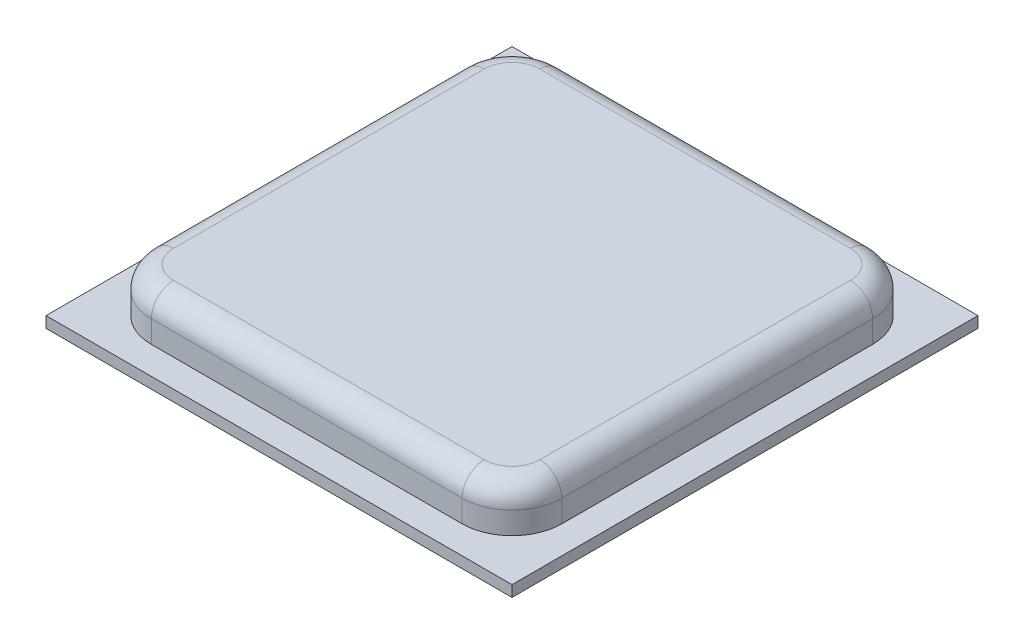
ISO-10303-21;
HEADER;
FILE_DESCRIPTION(('STEP AP214'),'2;1');
FILE_NAME('part.step','',(''),(''),'','','');
FILE_SCHEMA(('AUTOMOTIVE_DESIGN { 1 0 10303 214 1 1 1 1 }'));
ENDSEC;
DATA;
#1=APPLICATION_CONTEXT('core data for automotive mechanical design processes');
#2=APPLICATION_PROTOCOL_DEFINITION('international standard','automotive_design',2000,#1);
#3=PRODUCT_CONTEXT('',#1,'mechanical');
#4=PRODUCT('Part','Part','',(#3));
#5=PRODUCT_RELATED_PRODUCT_CATEGORY('part','',(#4));
#6=PRODUCT_DEFINITION_FORMATION('','',#4);
#7=PRODUCT_DEFINITION_CONTEXT('part definition',#1,'design');
#8=PRODUCT_DEFINITION('design','',#6,#7);
#9=PRODUCT_DEFINITION_SHAPE('','',#8);
#10=(LENGTH_UNIT() NAMED_UNIT(*) SI_UNIT(.MILLI.,.METRE.));
#11=(NAMED_UNIT(*) PLANE_ANGLE_UNIT() SI_UNIT($,.RADIAN.));
#12=(NAMED_UNIT(*) SI_UNIT($,.STERADIAN.) SOLID_ANGLE_UNIT());
#13=UNCERTAINTY_MEASURE_WITH_UNIT(LENGTH_MEASURE(1.E-05),#10,'distance_accuracy_value','');
#14=(GEOMETRIC_REPRESENTATION_CONTEXT(3) GLOBAL_UNCERTAINTY_ASSIGNED_CONTEXT((#13)) GLOBAL_UNIT_ASSIGNED_CONTEXT((#10,
#11,#12)) REPRESENTATION_CONTEXT('',''));
#15=CARTESIAN_POINT('',(0.,0.,0.));
#16=DIRECTION('',(0.,0.,1.));
#17=DIRECTION('',(1.,0.,0.));
#18=AXIS2_PLACEMENT_3D('',#15,#16,#17);
#19=CARTESIAN_POINT('',(0.,0.999999999999997,0.));
#20=DIRECTION('',(0.,1.,0.));
#21=DIRECTION('',(0.,0.,1.));
#22=AXIS2_PLACEMENT_3D('',#19,#20,#21);
#23=PLANE('',#22);
#24=DIRECTION('',(0.,0.,1.));
#25=VECTOR('',#24,1.);
#26=CARTESIAN_POINT('',(-21.,0.999999999999997,21.));
#27=LINE('',#26,#25);
#28=CARTESIAN_POINT('',(-21.,0.999999999999997,-21.));
#29=VERTEX_POINT('',#28);
#30=CARTESIAN_POINT('',(-21.,0.999999999999997,21.));
#31=VERTEX_POINT('',#30);
#32=EDGE_CURVE('E186',#29,#31,#27,.T.);
#33=ORIENTED_EDGE('',*,*,#32,.T.);
#34=DIRECTION('',(1.,0.,0.));
#35=VECTOR('',#34,1.);
#36=CARTESIAN_POINT('',(21.,0.999999999999997,21.));
#37=LINE('',#36,#35);
#38=CARTESIAN_POINT('',(21.,0.999999999999997,21.));
#39=VERTEX_POINT('',#38);
#40=EDGE_CURVE('E189',#31,#39,#37,.T.);
#41=ORIENTED_EDGE('',*,*,#40,.T.);
#42=DIRECTION('',(0.,0.,-1.));
#43=VECTOR('',#42,1.);
#44=CARTESIAN_POINT('',(21.,0.999999999999997,21.));
#45=LINE('',#44,#43);
#46=CARTESIAN_POINT('',(21.,0.999999999999997,-21.));
#47=VERTEX_POINT('',#46);
#48=EDGE_CURVE('E192',#39,#47,#45,.T.);
#49=ORIENTED_EDGE('',*,*,#48,.T.);
#50=DIRECTION('',(-1.,0.,0.));
#51=VECTOR('',#50,1.);
#52=CARTESIAN_POINT('',(21.,0.999999999999997,-21.));
#53=LINE('',#52,#51);
#54=EDGE_CURVE('E194',#47,#29,#53,.T.);
#55=ORIENTED_EDGE('',*,*,#54,.T.);
#56=EDGE_LOOP('',(#33,#41,#49,#55));
#57=FACE_BOUND('',#56,.T.);
#58=DIRECTION('',(0.,0.,1.));
#59=VECTOR('',#58,1.);
#60=CARTESIAN_POINT('',(-18.5,0.999999999999997,14.));
#61=LINE('',#60,#59);
#62=CARTESIAN_POINT('',(-18.5,0.999999999999997,-14.));
#63=VERTEX_POINT('',#62);
#64=CARTESIAN_POINT('',(-18.5,0.999999999999997,14.));
#65=VERTEX_POINT('',#64);
#66=EDGE_CURVE('E310',#63,#65,#61,.T.);
#67=ORIENTED_EDGE('',*,*,#66,.F.);
#68=CARTESIAN_POINT('',(-14.,0.999999999999997,-14.));
#69=DIRECTION('',(0.,1.,0.));
#70=DIRECTION('',(0.,0.,1.));
#71=AXIS2_PLACEMENT_3D('',#68,#69,#70);
#72=CIRCLE('',#71,4.5);
#73=CARTESIAN_POINT('',(-14.,0.999999999999997,-18.5));
#74=VERTEX_POINT('',#73);
#75=EDGE_CURVE('E307',#74,#63,#72,.T.);
#76=ORIENTED_EDGE('',*,*,#75,.F.);
#77=DIRECTION('',(-1.,0.,0.));
#78=VECTOR('',#77,1.);
#79=CARTESIAN_POINT('',(-14.,0.999999999999997,-18.5));
#80=LINE('',#79,#78);
#81=CARTESIAN_POINT('',(14.,0.999999999999997,-18.5));
#82=VERTEX_POINT('',#81);
#83=EDGE_CURVE('E182',#82,#74,#80,.T.);
#84=ORIENTED_EDGE('',*,*,#83,.F.);
#85=CARTESIAN_POINT('',(14.,0.999999999999997,-14.));
#86=DIRECTION('',(0.,1.,0.));
#87=DIRECTION('',(0.,0.,1.));
#88=AXIS2_PLACEMENT_3D('',#85,#86,#87);
#89=CIRCLE('',#88,4.5);
#90=CARTESIAN_POINT('',(18.5,0.999999999999997,-14.));
#91=VERTEX_POINT('',#90);
#92=EDGE_CURVE('E171',#91,#82,#89,.T.);
#93=ORIENTED_EDGE('',*,*,#92,.F.);
#94=DIRECTION('',(0.,0.,-1.));
#95=VECTOR('',#94,1.);
#96=CARTESIAN_POINT('',(18.5,0.999999999999997,14.));
#97=LINE('',#96,#95);
#98=CARTESIAN_POINT('',(18.5,0.999999999999997,14.));
#99=VERTEX_POINT('',#98);
#100=EDGE_CURVE('E154',#99,#91,#97,.T.);
#101=ORIENTED_EDGE('',*,*,#100,.F.);
#102=CARTESIAN_POINT('',(14.,0.999999999999997,14.));
#103=DIRECTION('',(0.,1.,0.));
#104=DIRECTION('',(0.,0.,-1.));
#105=AXIS2_PLACEMENT_3D('',#102,#103,#104);
#106=CIRCLE('',#105,4.5);
#107=CARTESIAN_POINT('',(14.,0.999999999999997,18.5));
#108=VERTEX_POINT('',#107);
#109=EDGE_CURVE('E167',#108,#99,#106,.T.);
#110=ORIENTED_EDGE('',*,*,#109,.F.);
#111=DIRECTION('',(1.,0.,0.));
#112=VECTOR('',#111,1.);
#113=CARTESIAN_POINT('',(-14.,0.999999999999997,18.5));
#114=LINE('',#113,#112);
#115=CARTESIAN_POINT('',(-14.,0.999999999999997,18.5));
#116=VERTEX_POINT('',#115);
#117=EDGE_CURVE('E175',#116,#108,#114,.T.);
#118=ORIENTED_EDGE('',*,*,#117,.F.);
#119=CARTESIAN_POINT('',(-14.,0.999999999999997,14.));
#120=DIRECTION('',(0.,1.,0.));
#121=DIRECTION('',(0.,0.,1.));
#122=AXIS2_PLACEMENT_3D('',#119,#120,#121);
#123=CIRCLE('',#122,4.5);
#124=EDGE_CURVE('E177',#65,#116,#123,.T.);
#125=ORIENTED_EDGE('',*,*,#124,.F.);
#126=EDGE_LOOP('',(#67,#76,#84,#93,#101,#110,#118,#125));
#127=FACE_BOUND('',#126,.T.);
#128=ADVANCED_FACE('F37',(#57,#127),#23,.T.);
#129=CARTESIAN_POINT('',(0.,0.,0.));
#130=DIRECTION('',(0.,1.,0.));
#131=DIRECTION('',(0.,0.,1.));
#132=AXIS2_PLACEMENT_3D('',#129,#130,#131);
#133=PLANE('',#132);
#134=DIRECTION('',(0.,0.,1.));
#135=VECTOR('',#134,1.);
#136=CARTESIAN_POINT('',(-21.,0.,21.));
#137=LINE('',#136,#135);
#138=CARTESIAN_POINT('',(-21.,0.,-21.));
#139=VERTEX_POINT('',#138);
#140=CARTESIAN_POINT('',(-21.,0.,21.));
#141=VERTEX_POINT('',#140);
#142=EDGE_CURVE('E185',#139,#141,#137,.T.);
#143=ORIENTED_EDGE('',*,*,#142,.F.);
#144=DIRECTION('',(-1.,0.,0.));
#145=VECTOR('',#144,1.);
#146=CARTESIAN_POINT('',(21.,0.,-21.));
#147=LINE('',#146,#145);
#148=CARTESIAN_POINT('',(21.,0.,-21.));
#149=VERTEX_POINT('',#148);
#150=EDGE_CURVE('E190',#149,#139,#147,.T.);
#151=ORIENTED_EDGE('',*,*,#150,.F.);
#152=DIRECTION('',(0.,0.,-1.));
#153=VECTOR('',#152,1.);
#154=CARTESIAN_POINT('',(21.,0.,21.));
#155=LINE('',#154,#153);
#156=CARTESIAN_POINT('',(21.,0.,21.));
#157=VERTEX_POINT('',#156);
#158=EDGE_CURVE('E201',#157,#149,#155,.T.);
#159=ORIENTED_EDGE('',*,*,#158,.F.);
#160=DIRECTION('',(1.,0.,0.));
#161=VECTOR('',#160,1.);
#162=CARTESIAN_POINT('',(21.,0.,21.));
#163=LINE('',#162,#161);
#164=EDGE_CURVE('E199',#141,#157,#163,.T.);
#165=ORIENTED_EDGE('',*,*,#164,.F.);
#166=EDGE_LOOP('',(#143,#151,#159,#165));
#167=FACE_BOUND('',#166,.T.);
#168=ADVANCED_FACE('F336',(#167),#133,.F.);
#169=CARTESIAN_POINT('',(-21.,0.999999999999997,21.));
#170=DIRECTION('',(1.,0.,0.));
#171=DIRECTION('',(0.,0.,-1.));
#172=AXIS2_PLACEMENT_3D('',#169,#170,#171);
#173=PLANE('',#172);
#174=ORIENTED_EDGE('',*,*,#142,.T.);
#175=DIRECTION('',(0.,-1.,0.));
#176=VECTOR('',#175,1.);
#177=CARTESIAN_POINT('',(-21.,0.999999999999997,21.));
#178=LINE('',#177,#176);
#179=EDGE_CURVE('E212',#31,#141,#178,.T.);
#180=ORIENTED_EDGE('',*,*,#179,.F.);
#181=ORIENTED_EDGE('',*,*,#32,.F.);
#182=DIRECTION('',(0.,-1.,0.));
#183=VECTOR('',#182,1.);
#184=CARTESIAN_POINT('',(-21.,0.999999999999997,-21.));
#185=LINE('',#184,#183);
#186=EDGE_CURVE('E196',#29,#139,#185,.T.);
#187=ORIENTED_EDGE('',*,*,#186,.T.);
#188=EDGE_LOOP('',(#174,#180,#181,#187));
#189=FACE_BOUND('',#188,.T.);
#190=ADVANCED_FACE('F342',(#189),#173,.F.);
#191=CARTESIAN_POINT('',(21.,0.999999999999997,21.));
#192=DIRECTION('',(0.,0.,-1.));
#193=DIRECTION('',(-1.,0.,0.));
#194=AXIS2_PLACEMENT_3D('',#191,#192,#193);
#195=PLANE('',#194);
#196=ORIENTED_EDGE('',*,*,#164,.T.);
#197=DIRECTION('',(0.,-1.,0.));
#198=VECTOR('',#197,1.);
#199=CARTESIAN_POINT('',(21.,0.999999999999997,21.));
#200=LINE('',#199,#198);
#201=EDGE_CURVE('E209',#39,#157,#200,.T.);
#202=ORIENTED_EDGE('',*,*,#201,.F.);
#203=ORIENTED_EDGE('',*,*,#40,.F.);
#204=ORIENTED_EDGE('',*,*,#179,.T.);
#205=EDGE_LOOP('',(#196,#202,#203,#204));
#206=FACE_BOUND('',#205,.T.);
#207=ADVANCED_FACE('F352',(#206),#195,.F.);
#208=CARTESIAN_POINT('',(21.,0.999999999999997,21.));
#209=DIRECTION('',(-1.,0.,0.));
#210=DIRECTION('',(0.,0.,1.));
#211=AXIS2_PLACEMENT_3D('',#208,#209,#210);
#212=PLANE('',#211);
#213=ORIENTED_EDGE('',*,*,#158,.T.);
#214=DIRECTION('',(0.,-1.,0.));
#215=VECTOR('',#214,1.);
#216=CARTESIAN_POINT('',(21.,0.999999999999997,-21.));
#217=LINE('',#216,#215);
#218=EDGE_CURVE('E206',#47,#149,#217,.T.);
#219=ORIENTED_EDGE('',*,*,#218,.F.);
#220=ORIENTED_EDGE('',*,*,#48,.F.);
#221=ORIENTED_EDGE('',*,*,#201,.T.);
#222=EDGE_LOOP('',(#213,#219,#220,#221));
#223=FACE_BOUND('',#222,.T.);
#224=ADVANCED_FACE('F348',(#223),#212,.F.);
#225=CARTESIAN_POINT('',(21.,0.999999999999997,-21.));
#226=DIRECTION('',(0.,0.,1.));
#227=DIRECTION('',(1.,0.,0.));
#228=AXIS2_PLACEMENT_3D('',#225,#226,#227);
#229=PLANE('',#228);
#230=ORIENTED_EDGE('',*,*,#150,.T.);
#231=ORIENTED_EDGE('',*,*,#186,.F.);
#232=ORIENTED_EDGE('',*,*,#54,.F.);
#233=ORIENTED_EDGE('',*,*,#218,.T.);
#234=EDGE_LOOP('',(#230,#231,#232,#233));
#235=FACE_BOUND('',#234,.T.);
#236=ADVANCED_FACE('F333',(#235),#229,.F.);
#237=CARTESIAN_POINT('',(18.5,5.,0.));
#238=DIRECTION('',(-1.,0.,0.));
#239=DIRECTION('',(0.,0.,1.));
#240=AXIS2_PLACEMENT_3D('',#237,#238,#239);
#241=PLANE('',#240);
#242=DIRECTION('',(0.,-1.,0.));
#243=VECTOR('',#242,1.);
#244=CARTESIAN_POINT('',(18.5,5.,-14.));
#245=LINE('',#244,#243);
#246=CARTESIAN_POINT('',(18.5,3.,-14.));
#247=VERTEX_POINT('',#246);
#248=EDGE_CURVE('E305',#247,#91,#245,.T.);
#249=ORIENTED_EDGE('',*,*,#248,.F.);
#250=DIRECTION('',(0.,0.,-1.));
#251=VECTOR('',#250,1.);
#252=CARTESIAN_POINT('',(18.5,3.,14.));
#253=LINE('',#252,#251);
#254=CARTESIAN_POINT('',(18.5,3.,14.));
#255=VERTEX_POINT('',#254);
#256=EDGE_CURVE('E11',#247,#255,#253,.F.);
#257=ORIENTED_EDGE('',*,*,#256,.T.);
#258=DIRECTION('',(0.,-1.,0.));
#259=VECTOR('',#258,1.);
#260=CARTESIAN_POINT('',(18.5,5.,14.));
#261=LINE('',#260,#259);
#262=EDGE_CURVE('E151',#255,#99,#261,.T.);
#263=ORIENTED_EDGE('',*,*,#262,.T.);
#264=ORIENTED_EDGE('',*,*,#100,.T.);
#265=EDGE_LOOP('',(#249,#257,#263,#264));
#266=FACE_BOUND('',#265,.T.);
#267=ADVANCED_FACE('F153',(#266),#241,.F.);
#268=CARTESIAN_POINT('',(14.,5.,-14.));
#269=DIRECTION('',(0.,-1.,0.));
#270=DIRECTION('',(0.,0.,-1.));
#271=AXIS2_PLACEMENT_3D('',#268,#269,#270);
#272=CYLINDRICAL_SURFACE('',#271,4.5);
#273=DIRECTION('',(0.,-1.,0.));
#274=VECTOR('',#273,1.);
#275=CARTESIAN_POINT('',(14.,5.,-18.5));
#276=LINE('',#275,#274);
#277=CARTESIAN_POINT('',(14.,3.,-18.5));
#278=VERTEX_POINT('',#277);
#279=EDGE_CURVE('E303',#278,#82,#276,.T.);
#280=ORIENTED_EDGE('',*,*,#279,.F.);
#281=CARTESIAN_POINT('',(14.,3.,-14.));
#282=DIRECTION('',(0.,1.,0.));
#283=DIRECTION('',(0.,0.,1.));
#284=AXIS2_PLACEMENT_3D('',#281,#282,#283);
#285=CIRCLE('',#284,4.5);
#286=EDGE_CURVE('E46',#278,#247,#285,.F.);
#287=ORIENTED_EDGE('',*,*,#286,.T.);
#288=ORIENTED_EDGE('',*,*,#248,.T.);
#289=ORIENTED_EDGE('',*,*,#92,.T.);
#290=EDGE_LOOP('',(#280,#287,#288,#289));
#291=FACE_BOUND('',#290,.T.);
#292=ADVANCED_FACE('F325',(#291),#272,.T.);
#293=CARTESIAN_POINT('',(0.,5.,-18.5));
#294=DIRECTION('',(0.,0.,-1.));
#295=DIRECTION('',(-1.,0.,0.));
#296=AXIS2_PLACEMENT_3D('',#293,#294,#295);
#297=PLANE('',#296);
#298=DIRECTION('',(0.,-1.,0.));
#299=VECTOR('',#298,1.);
#300=CARTESIAN_POINT('',(-14.,5.,-18.5));
#301=LINE('',#300,#299);
#302=CARTESIAN_POINT('',(-14.,3.,-18.5));
#303=VERTEX_POINT('',#302);
#304=EDGE_CURVE('E301',#303,#74,#301,.T.);
#305=ORIENTED_EDGE('',*,*,#304,.F.);
#306=DIRECTION('',(1.,0.,0.));
#307=VECTOR('',#306,1.);
#308=CARTESIAN_POINT('',(0.,3.,-18.5));
#309=LINE('',#308,#307);
#310=EDGE_CURVE('E61',#303,#278,#309,.T.);
#311=ORIENTED_EDGE('',*,*,#310,.T.);
#312=ORIENTED_EDGE('',*,*,#279,.T.);
#313=ORIENTED_EDGE('',*,*,#83,.T.);
#314=EDGE_LOOP('',(#305,#311,#312,#313));
#315=FACE_BOUND('',#314,.T.);
#316=ADVANCED_FACE('F324',(#315),#297,.T.);
#317=CARTESIAN_POINT('',(-14.,5.,-14.));
#318=DIRECTION('',(0.,-1.,0.));
#319=DIRECTION('',(0.,0.,-1.));
#320=AXIS2_PLACEMENT_3D('',#317,#318,#319);
#321=CYLINDRICAL_SURFACE('',#320,4.5);
#322=DIRECTION('',(0.,-1.,0.));
#323=VECTOR('',#322,1.);
#324=CARTESIAN_POINT('',(-18.5,5.,-14.));
#325=LINE('',#324,#323);
#326=CARTESIAN_POINT('',(-18.5,3.,-14.));
#327=VERTEX_POINT('',#326);
#328=EDGE_CURVE('E299',#327,#63,#325,.T.);
#329=ORIENTED_EDGE('',*,*,#328,.F.);
#330=CARTESIAN_POINT('',(-14.,3.,-14.));
#331=DIRECTION('',(0.,1.,0.));
#332=DIRECTION('',(0.,0.,1.));
#333=AXIS2_PLACEMENT_3D('',#330,#331,#332);
#334=CIRCLE('',#333,4.5);
#335=EDGE_CURVE('E240',#327,#303,#334,.F.);
#336=ORIENTED_EDGE('',*,*,#335,.T.);
#337=ORIENTED_EDGE('',*,*,#304,.T.);
#338=ORIENTED_EDGE('',*,*,#75,.T.);
#339=EDGE_LOOP('',(#329,#336,#337,#338));
#340=FACE_BOUND('',#339,.T.);
#341=ADVANCED_FACE('F323',(#340),#321,.T.);
#342=CARTESIAN_POINT('',(-18.5,5.,0.));
#343=DIRECTION('',(-1.,0.,0.));
#344=DIRECTION('',(0.,0.,1.));
#345=AXIS2_PLACEMENT_3D('',#342,#343,#344);
#346=PLANE('',#345);
#347=DIRECTION('',(0.,-1.,0.));
#348=VECTOR('',#347,1.);
#349=CARTESIAN_POINT('',(-18.5,5.,14.));
#350=LINE('',#349,#348);
#351=CARTESIAN_POINT('',(-18.5,3.,14.));
#352=VERTEX_POINT('',#351);
#353=EDGE_CURVE('E295',#352,#65,#350,.T.);
#354=ORIENTED_EDGE('',*,*,#353,.F.);
#355=DIRECTION('',(0.,0.,-1.));
#356=VECTOR('',#355,1.);
#357=CARTESIAN_POINT('',(-18.5,3.,0.));
#358=LINE('',#357,#356);
#359=EDGE_CURVE('E238',#352,#327,#358,.T.);
#360=ORIENTED_EDGE('',*,*,#359,.T.);
#361=ORIENTED_EDGE('',*,*,#328,.T.);
#362=ORIENTED_EDGE('',*,*,#66,.T.);
#363=EDGE_LOOP('',(#354,#360,#361,#362));
#364=FACE_BOUND('',#363,.T.);
#365=ADVANCED_FACE('F320',(#364),#346,.T.);
#366=CARTESIAN_POINT('',(-14.,5.,14.));
#367=DIRECTION('',(0.,-1.,0.));
#368=DIRECTION('',(0.,0.,-1.));
#369=AXIS2_PLACEMENT_3D('',#366,#367,#368);
#370=CYLINDRICAL_SURFACE('',#369,4.5);
#371=DIRECTION('',(0.,-1.,0.));
#372=VECTOR('',#371,1.);
#373=CARTESIAN_POINT('',(-14.,5.,18.5));
#374=LINE('',#373,#372);
#375=CARTESIAN_POINT('',(-14.,3.,18.5));
#376=VERTEX_POINT('',#375);
#377=EDGE_CURVE('E293',#376,#116,#374,.T.);
#378=ORIENTED_EDGE('',*,*,#377,.F.);
#379=CARTESIAN_POINT('',(-14.,3.,14.));
#380=DIRECTION('',(0.,1.,0.));
#381=DIRECTION('',(0.,0.,1.));
#382=AXIS2_PLACEMENT_3D('',#379,#380,#381);
#383=CIRCLE('',#382,4.5);
#384=EDGE_CURVE('E236',#376,#352,#383,.F.);
#385=ORIENTED_EDGE('',*,*,#384,.T.);
#386=ORIENTED_EDGE('',*,*,#353,.T.);
#387=ORIENTED_EDGE('',*,*,#124,.T.);
#388=EDGE_LOOP('',(#378,#385,#386,#387));
#389=FACE_BOUND('',#388,.T.);
#390=ADVANCED_FACE('F315',(#389),#370,.T.);
#391=CARTESIAN_POINT('',(0.,5.,18.5));
#392=DIRECTION('',(0.,0.,-1.));
#393=DIRECTION('',(-1.,0.,0.));
#394=AXIS2_PLACEMENT_3D('',#391,#392,#393);
#395=PLANE('',#394);
#396=DIRECTION('',(0.,-1.,0.));
#397=VECTOR('',#396,1.);
#398=CARTESIAN_POINT('',(14.,5.,18.5));
#399=LINE('',#398,#397);
#400=CARTESIAN_POINT('',(14.,3.,18.5));
#401=VERTEX_POINT('',#400);
#402=EDGE_CURVE('E160',#401,#108,#399,.T.);
#403=ORIENTED_EDGE('',*,*,#402,.F.);
#404=DIRECTION('',(1.,0.,0.));
#405=VECTOR('',#404,1.);
#406=CARTESIAN_POINT('',(-14.,3.,18.5));
#407=LINE('',#406,#405);
#408=EDGE_CURVE('E234',#401,#376,#407,.F.);
#409=ORIENTED_EDGE('',*,*,#408,.T.);
#410=ORIENTED_EDGE('',*,*,#377,.T.);
#411=ORIENTED_EDGE('',*,*,#117,.T.);
#412=EDGE_LOOP('',(#403,#409,#410,#411));
#413=FACE_BOUND('',#412,.T.);
#414=ADVANCED_FACE('F291',(#413),#395,.F.);
#415=CARTESIAN_POINT('',(14.,5.,14.));
#416=DIRECTION('',(0.,-1.,0.));
#417=DIRECTION('',(0.,0.,-1.));
#418=AXIS2_PLACEMENT_3D('',#415,#416,#417);
#419=CYLINDRICAL_SURFACE('',#418,4.5);
#420=ORIENTED_EDGE('',*,*,#262,.F.);
#421=CARTESIAN_POINT('',(14.,3.,14.));
#422=DIRECTION('',(0.,1.,0.));
#423=DIRECTION('',(0.,0.,1.));
#424=AXIS2_PLACEMENT_3D('',#421,#422,#423);
#425=CIRCLE('',#424,4.5);
#426=EDGE_CURVE('E215',#255,#401,#425,.F.);
#427=ORIENTED_EDGE('',*,*,#426,.T.);
#428=ORIENTED_EDGE('',*,*,#402,.T.);
#429=ORIENTED_EDGE('',*,*,#109,.T.);
#430=EDGE_LOOP('',(#420,#427,#428,#429));
#431=FACE_BOUND('',#430,.T.);
#432=ADVANCED_FACE('F173',(#431),#419,.T.);
#433=CARTESIAN_POINT('',(0.,5.,0.));
#434=DIRECTION('',(0.,1.,0.));
#435=DIRECTION('',(0.,0.,1.));
#436=AXIS2_PLACEMENT_3D('',#433,#434,#435);
#437=PLANE('',#436);
#438=DIRECTION('',(1.,0.,0.));
#439=VECTOR('',#438,1.);
#440=CARTESIAN_POINT('',(14.,5.,16.5));
#441=LINE('',#440,#439);
#442=CARTESIAN_POINT('',(-14.,5.,16.5));
#443=VERTEX_POINT('',#442);
#444=CARTESIAN_POINT('',(14.,5.,16.5));
#445=VERTEX_POINT('',#444);
#446=EDGE_CURVE('E229',#443,#445,#441,.T.);
#447=ORIENTED_EDGE('',*,*,#446,.T.);
#448=CARTESIAN_POINT('',(14.,5.,14.));
#449=DIRECTION('',(0.,1.,0.));
#450=DIRECTION('',(0.,0.,1.));
#451=AXIS2_PLACEMENT_3D('',#448,#449,#450);
#452=CIRCLE('',#451,2.5);
#453=CARTESIAN_POINT('',(16.5,5.,14.));
#454=VERTEX_POINT('',#453);
#455=EDGE_CURVE('E231',#445,#454,#452,.T.);
#456=ORIENTED_EDGE('',*,*,#455,.T.);
#457=DIRECTION('',(0.,0.,-1.));
#458=VECTOR('',#457,1.);
#459=CARTESIAN_POINT('',(16.5,5.,-14.));
#460=LINE('',#459,#458);
#461=CARTESIAN_POINT('',(16.5,5.,-14.));
#462=VERTEX_POINT('',#461);
#463=EDGE_CURVE('E217',#454,#462,#460,.T.);
#464=ORIENTED_EDGE('',*,*,#463,.T.);
#465=CARTESIAN_POINT('',(14.,5.,-14.));
#466=DIRECTION('',(0.,1.,0.));
#467=DIRECTION('',(0.,0.,1.));
#468=AXIS2_PLACEMENT_3D('',#465,#466,#467);
#469=CIRCLE('',#468,2.5);
#470=CARTESIAN_POINT('',(14.,5.,-16.5));
#471=VERTEX_POINT('',#470);
#472=EDGE_CURVE('E219',#462,#471,#469,.T.);
#473=ORIENTED_EDGE('',*,*,#472,.T.);
#474=DIRECTION('',(1.,0.,0.));
#475=VECTOR('',#474,1.);
#476=CARTESIAN_POINT('',(0.,5.,-16.5));
#477=LINE('',#476,#475);
#478=CARTESIAN_POINT('',(-14.,5.,-16.5));
#479=VERTEX_POINT('',#478);
#480=EDGE_CURVE('E221',#471,#479,#477,.F.);
#481=ORIENTED_EDGE('',*,*,#480,.T.);
#482=CARTESIAN_POINT('',(-14.,5.,-14.));
#483=DIRECTION('',(0.,1.,0.));
#484=DIRECTION('',(0.,0.,1.));
#485=AXIS2_PLACEMENT_3D('',#482,#483,#484);
#486=CIRCLE('',#485,2.5);
#487=CARTESIAN_POINT('',(-16.5,5.,-14.));
#488=VERTEX_POINT('',#487);
#489=EDGE_CURVE('E223',#479,#488,#486,.T.);
#490=ORIENTED_EDGE('',*,*,#489,.T.);
#491=DIRECTION('',(0.,0.,-1.));
#492=VECTOR('',#491,1.);
#493=CARTESIAN_POINT('',(-16.5,5.,0.));
#494=LINE('',#493,#492);
#495=CARTESIAN_POINT('',(-16.5,5.,14.));
#496=VERTEX_POINT('',#495);
#497=EDGE_CURVE('E225',#488,#496,#494,.F.);
#498=ORIENTED_EDGE('',*,*,#497,.T.);
#499=CARTESIAN_POINT('',(-14.,5.,14.));
#500=DIRECTION('',(0.,1.,0.));
#501=DIRECTION('',(0.,0.,1.));
#502=AXIS2_PLACEMENT_3D('',#499,#500,#501);
#503=CIRCLE('',#502,2.5);
#504=EDGE_CURVE('E227',#496,#443,#503,.T.);
#505=ORIENTED_EDGE('',*,*,#504,.T.);
#506=EDGE_LOOP('',(#447,#456,#464,#473,#481,#490,#498,#505));
#507=FACE_BOUND('',#506,.T.);
#508=ADVANCED_FACE('F275',(#507),#437,.T.);
#509=CARTESIAN_POINT('',(-14.,3.,-14.));
#510=DIRECTION('',(0.,1.,0.));
#511=DIRECTION('',(0.,0.,1.));
#512=AXIS2_PLACEMENT_3D('',#509,#510,#511);
#513=TOROIDAL_SURFACE('',#512,2.5,2.);
#514=CARTESIAN_POINT('',(-16.5,3.,-14.));
#515=DIRECTION('',(0.,0.,1.));
#516=DIRECTION('',(1.,0.,0.));
#517=AXIS2_PLACEMENT_3D('',#514,#515,#516);
#518=CIRCLE('',#517,2.);
#519=EDGE_CURVE('E259',#488,#327,#518,.T.);
#520=ORIENTED_EDGE('',*,*,#519,.F.);
#521=ORIENTED_EDGE('',*,*,#489,.F.);
#522=CARTESIAN_POINT('',(-14.,3.,-16.5));
#523=DIRECTION('',(1.,0.,0.));
#524=DIRECTION('',(0.,0.,-1.));
#525=AXIS2_PLACEMENT_3D('',#522,#523,#524);
#526=CIRCLE('',#525,2.);
#527=EDGE_CURVE('E41',#303,#479,#526,.T.);
#528=ORIENTED_EDGE('',*,*,#527,.F.);
#529=ORIENTED_EDGE('',*,*,#335,.F.);
#530=EDGE_LOOP('',(#520,#521,#528,#529));
#531=FACE_BOUND('',#530,.T.);
#532=ADVANCED_FACE('F39',(#531),#513,.T.);
#533=CARTESIAN_POINT('',(0.,3.,-16.5));
#534=DIRECTION('',(1.,0.,0.));
#535=DIRECTION('',(0.,0.,-1.));
#536=AXIS2_PLACEMENT_3D('',#533,#534,#535);
#537=CYLINDRICAL_SURFACE('',#536,2.);
#538=ORIENTED_EDGE('',*,*,#527,.T.);
#539=ORIENTED_EDGE('',*,*,#480,.F.);
#540=CARTESIAN_POINT('',(14.,3.,-16.5));
#541=DIRECTION('',(1.,0.,0.));
#542=DIRECTION('',(0.,0.,-1.));
#543=AXIS2_PLACEMENT_3D('',#540,#541,#542);
#544=CIRCLE('',#543,2.);
#545=EDGE_CURVE('E257',#278,#471,#544,.T.);
#546=ORIENTED_EDGE('',*,*,#545,.F.);
#547=ORIENTED_EDGE('',*,*,#310,.F.);
#548=EDGE_LOOP('',(#538,#539,#546,#547));
#549=FACE_BOUND('',#548,.T.);
#550=ADVANCED_FACE('F269',(#549),#537,.T.);
#551=CARTESIAN_POINT('',(-16.5,3.,0.));
#552=DIRECTION('',(0.,0.,-1.));
#553=DIRECTION('',(-1.,0.,0.));
#554=AXIS2_PLACEMENT_3D('',#551,#552,#553);
#555=CYLINDRICAL_SURFACE('',#554,2.);
#556=ORIENTED_EDGE('',*,*,#519,.T.);
#557=ORIENTED_EDGE('',*,*,#359,.F.);
#558=CARTESIAN_POINT('',(-16.5,3.,14.));
#559=DIRECTION('',(0.,0.,1.));
#560=DIRECTION('',(1.,0.,0.));
#561=AXIS2_PLACEMENT_3D('',#558,#559,#560);
#562=CIRCLE('',#561,2.);
#563=EDGE_CURVE('E254',#496,#352,#562,.T.);
#564=ORIENTED_EDGE('',*,*,#563,.F.);
#565=ORIENTED_EDGE('',*,*,#497,.F.);
#566=EDGE_LOOP('',(#556,#557,#564,#565));
#567=FACE_BOUND('',#566,.T.);
#568=ADVANCED_FACE('F374',(#567),#555,.T.);
#569=CARTESIAN_POINT('',(14.,3.,-14.));
#570=DIRECTION('',(0.,1.,0.));
#571=DIRECTION('',(0.,0.,1.));
#572=AXIS2_PLACEMENT_3D('',#569,#570,#571);
#573=TOROIDAL_SURFACE('',#572,2.5,2.);
#574=ORIENTED_EDGE('',*,*,#545,.T.);
#575=ORIENTED_EDGE('',*,*,#472,.F.);
#576=CARTESIAN_POINT('',(16.5,3.,-14.));
#577=DIRECTION('',(0.,0.,1.));
#578=DIRECTION('',(1.,0.,0.));
#579=AXIS2_PLACEMENT_3D('',#576,#577,#578);
#580=CIRCLE('',#579,2.);
#581=EDGE_CURVE('E251',#247,#462,#580,.T.);
#582=ORIENTED_EDGE('',*,*,#581,.F.);
#583=ORIENTED_EDGE('',*,*,#286,.F.);
#584=EDGE_LOOP('',(#574,#575,#582,#583));
#585=FACE_BOUND('',#584,.T.);
#586=ADVANCED_FACE('F281',(#585),#573,.T.);
#587=CARTESIAN_POINT('',(-14.,3.,14.));
#588=DIRECTION('',(0.,1.,0.));
#589=DIRECTION('',(0.,0.,1.));
#590=AXIS2_PLACEMENT_3D('',#587,#588,#589);
#591=TOROIDAL_SURFACE('',#590,2.5,2.);
#592=ORIENTED_EDGE('',*,*,#563,.T.);
#593=ORIENTED_EDGE('',*,*,#384,.F.);
#594=CARTESIAN_POINT('',(-14.,3.,16.5));
#595=DIRECTION('',(1.,0.,0.));
#596=DIRECTION('',(0.,0.,-1.));
#597=AXIS2_PLACEMENT_3D('',#594,#595,#596);
#598=CIRCLE('',#597,2.);
#599=EDGE_CURVE('E248',#443,#376,#598,.T.);
#600=ORIENTED_EDGE('',*,*,#599,.F.);
#601=ORIENTED_EDGE('',*,*,#504,.F.);
#602=EDGE_LOOP('',(#592,#593,#600,#601));
#603=FACE_BOUND('',#602,.T.);
#604=ADVANCED_FACE('F368',(#603),#591,.T.);
#605=CARTESIAN_POINT('',(16.5,3.,0.));
#606=DIRECTION('',(0.,0.,1.));
#607=DIRECTION('',(1.,0.,0.));
#608=AXIS2_PLACEMENT_3D('',#605,#606,#607);
#609=CYLINDRICAL_SURFACE('',#608,2.);
#610=ORIENTED_EDGE('',*,*,#581,.T.);
#611=ORIENTED_EDGE('',*,*,#463,.F.);
#612=CARTESIAN_POINT('',(16.5,3.,14.));
#613=DIRECTION('',(0.,0.,1.));
#614=DIRECTION('',(1.,0.,0.));
#615=AXIS2_PLACEMENT_3D('',#612,#613,#614);
#616=CIRCLE('',#615,2.);
#617=EDGE_CURVE('E246',#255,#454,#616,.T.);
#618=ORIENTED_EDGE('',*,*,#617,.F.);
#619=ORIENTED_EDGE('',*,*,#256,.F.);
#620=EDGE_LOOP('',(#610,#611,#618,#619));
#621=FACE_BOUND('',#620,.T.);
#622=ADVANCED_FACE('F283',(#621),#609,.T.);
#623=CARTESIAN_POINT('',(0.,3.,16.5));
#624=DIRECTION('',(-1.,0.,0.));
#625=DIRECTION('',(0.,0.,1.));
#626=AXIS2_PLACEMENT_3D('',#623,#624,#625);
#627=CYLINDRICAL_SURFACE('',#626,2.);
#628=ORIENTED_EDGE('',*,*,#599,.T.);
#629=ORIENTED_EDGE('',*,*,#408,.F.);
#630=CARTESIAN_POINT('',(14.,3.,16.5));
#631=DIRECTION('',(1.,0.,0.));
#632=DIRECTION('',(0.,0.,-1.));
#633=AXIS2_PLACEMENT_3D('',#630,#631,#632);
#634=CIRCLE('',#633,2.);
#635=EDGE_CURVE('E244',#445,#401,#634,.T.);
#636=ORIENTED_EDGE('',*,*,#635,.F.);
#637=ORIENTED_EDGE('',*,*,#446,.F.);
#638=EDGE_LOOP('',(#628,#629,#636,#637));
#639=FACE_BOUND('',#638,.T.);
#640=ADVANCED_FACE('F362',(#639),#627,.T.);
#641=CARTESIAN_POINT('',(14.,3.,14.));
#642=DIRECTION('',(0.,1.,0.));
#643=DIRECTION('',(0.,0.,1.));
#644=AXIS2_PLACEMENT_3D('',#641,#642,#643);
#645=TOROIDAL_SURFACE('',#644,2.5,2.);
#646=ORIENTED_EDGE('',*,*,#617,.T.);
#647=ORIENTED_EDGE('',*,*,#455,.F.);
#648=ORIENTED_EDGE('',*,*,#635,.T.);
#649=ORIENTED_EDGE('',*,*,#426,.F.);
#650=EDGE_LOOP('',(#646,#647,#648,#649));
#651=FACE_BOUND('',#650,.T.);
#652=ADVANCED_FACE('F287',(#651),#645,.T.);
#653=CLOSED_SHELL('',(#128,#168,#190,#207,#224,#236,#267,#292,#316,#341,#365,#390,#414,#432,
#508,#532,#550,#568,#586,#604,#622,#640,#652));
#654=MANIFOLD_SOLID_BREP('B2',#653);
#655=ADVANCED_BREP_SHAPE_REPRESENTATION('',(#18,#654),#14);
#656=SHAPE_DEFINITION_REPRESENTATION(#9,#655);
ENDSEC;
END-ISO-10303-21;
